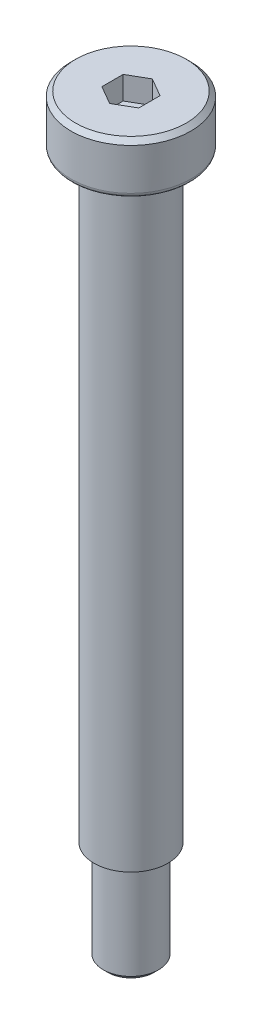
ISO-10303-21;
HEADER;
FILE_DESCRIPTION(('STEP AP214'),'2;1');
FILE_NAME('part.step','',(''),(''),'','','');
FILE_SCHEMA(('AUTOMOTIVE_DESIGN { 1 0 10303 214 1 1 1 1 }'));
ENDSEC;
DATA;
#1=APPLICATION_CONTEXT('core data for automotive mechanical design processes');
#2=APPLICATION_PROTOCOL_DEFINITION('international standard','automotive_design',2000,#1);
#3=PRODUCT_CONTEXT('',#1,'mechanical');
#4=PRODUCT('Part','Part','',(#3));
#5=PRODUCT_RELATED_PRODUCT_CATEGORY('part','',(#4));
#6=PRODUCT_DEFINITION_FORMATION('','',#4);
#7=PRODUCT_DEFINITION_CONTEXT('part definition',#1,'design');
#8=PRODUCT_DEFINITION('design','',#6,#7);
#9=PRODUCT_DEFINITION_SHAPE('','',#8);
#10=(LENGTH_UNIT() NAMED_UNIT(*) SI_UNIT(.MILLI.,.METRE.));
#11=(NAMED_UNIT(*) PLANE_ANGLE_UNIT() SI_UNIT($,.RADIAN.));
#12=(NAMED_UNIT(*) SI_UNIT($,.STERADIAN.) SOLID_ANGLE_UNIT());
#13=UNCERTAINTY_MEASURE_WITH_UNIT(LENGTH_MEASURE(1.E-05),#10,'distance_accuracy_value','');
#14=(GEOMETRIC_REPRESENTATION_CONTEXT(3) GLOBAL_UNCERTAINTY_ASSIGNED_CONTEXT((#13)) GLOBAL_UNIT_ASSIGNED_CONTEXT((#10,
#11,#12)) REPRESENTATION_CONTEXT('',''));
#15=CARTESIAN_POINT('',(0.,0.,0.));
#16=DIRECTION('',(0.,0.,1.));
#17=DIRECTION('',(1.,0.,0.));
#18=AXIS2_PLACEMENT_3D('',#15,#16,#17);
#19=CARTESIAN_POINT('',(0.,0.,0.));
#20=DIRECTION('',(0.,-1.,0.));
#21=DIRECTION('',(1.,0.,0.));
#22=AXIS2_PLACEMENT_3D('',#19,#20,#21);
#23=PLANE('',#22);
#24=CARTESIAN_POINT('',(0.,0.,0.));
#25=DIRECTION('',(0.,-1.,0.));
#26=DIRECTION('',(1.,0.,0.));
#27=AXIS2_PLACEMENT_3D('',#24,#25,#26);
#28=CIRCLE('',#27,6.);
#29=CARTESIAN_POINT('',(6.,0.,0.));
#30=VERTEX_POINT('',#29);
#31=EDGE_CURVE('E166',#30,#30,#28,.F.);
#32=ORIENTED_EDGE('',*,*,#31,.T.);
#33=EDGE_LOOP('',(#32));
#34=FACE_BOUND('',#33,.T.);
#35=DIRECTION('',(0.866025403784439,0.,-0.5));
#36=VECTOR('',#35,1.);
#37=CARTESIAN_POINT('',(0.,0.,2.3094010767585));
#38=LINE('',#37,#36);
#39=CARTESIAN_POINT('',(0.,0.,2.3094010767585));
#40=VERTEX_POINT('',#39);
#41=CARTESIAN_POINT('',(2.,0.,1.15470053837925));
#42=VERTEX_POINT('',#41);
#43=EDGE_CURVE('E133',#40,#42,#38,.T.);
#44=ORIENTED_EDGE('',*,*,#43,.F.);
#45=DIRECTION('',(0.866025403784439,0.,0.5));
#46=VECTOR('',#45,1.);
#47=CARTESIAN_POINT('',(-2.,0.,1.15470053837925));
#48=LINE('',#47,#46);
#49=CARTESIAN_POINT('',(-2.,0.,1.15470053837925));
#50=VERTEX_POINT('',#49);
#51=EDGE_CURVE('E59',#50,#40,#48,.T.);
#52=ORIENTED_EDGE('',*,*,#51,.F.);
#53=DIRECTION('',(0.,0.,1.));
#54=VECTOR('',#53,1.);
#55=CARTESIAN_POINT('',(-2.,0.,-1.15470053837925));
#56=LINE('',#55,#54);
#57=CARTESIAN_POINT('',(-2.,0.,-1.15470053837925));
#58=VERTEX_POINT('',#57);
#59=EDGE_CURVE('E142',#58,#50,#56,.T.);
#60=ORIENTED_EDGE('',*,*,#59,.F.);
#61=DIRECTION('',(-0.866025403784439,0.,0.5));
#62=VECTOR('',#61,1.);
#63=CARTESIAN_POINT('',(0.,0.,-2.3094010767585));
#64=LINE('',#63,#62);
#65=CARTESIAN_POINT('',(0.,0.,-2.3094010767585));
#66=VERTEX_POINT('',#65);
#67=EDGE_CURVE('E140',#66,#58,#64,.T.);
#68=ORIENTED_EDGE('',*,*,#67,.F.);
#69=DIRECTION('',(-0.866025403784438,0.,-0.5));
#70=VECTOR('',#69,1.);
#71=CARTESIAN_POINT('',(2.,0.,-1.15470053837925));
#72=LINE('',#71,#70);
#73=CARTESIAN_POINT('',(2.,0.,-1.15470053837925));
#74=VERTEX_POINT('',#73);
#75=EDGE_CURVE('E107',#74,#66,#72,.T.);
#76=ORIENTED_EDGE('',*,*,#75,.F.);
#77=DIRECTION('',(0.,0.,-1.));
#78=VECTOR('',#77,1.);
#79=CARTESIAN_POINT('',(2.,0.,1.15470053837925));
#80=LINE('',#79,#78);
#81=EDGE_CURVE('E136',#42,#74,#80,.T.);
#82=ORIENTED_EDGE('',*,*,#81,.F.);
#83=EDGE_LOOP('',(#44,#52,#60,#68,#76,#82));
#84=FACE_BOUND('',#83,.T.);
#85=ADVANCED_FACE('F43',(#34,#84),#23,.F.);
#86=CARTESIAN_POINT('',(0.,5.,0.));
#87=DIRECTION('',(0.,1.,0.));
#88=DIRECTION('',(-1.,0.,0.));
#89=AXIS2_PLACEMENT_3D('',#86,#87,#88);
#90=CYLINDRICAL_SURFACE('',#89,6.5);
#91=CARTESIAN_POINT('',(0.,-5.00000000000001,0.));
#92=DIRECTION('',(0.,1.,0.));
#93=DIRECTION('',(-1.,0.,0.));
#94=AXIS2_PLACEMENT_3D('',#91,#92,#93);
#95=CIRCLE('',#94,6.5);
#96=CARTESIAN_POINT('',(-6.5,-5.00000000000001,0.));
#97=VERTEX_POINT('',#96);
#98=EDGE_CURVE('E172',#97,#97,#95,.T.);
#99=ORIENTED_EDGE('',*,*,#98,.T.);
#100=EDGE_LOOP('',(#99));
#101=FACE_BOUND('',#100,.T.);
#102=CARTESIAN_POINT('',(0.,-0.500000000000005,0.));
#103=DIRECTION('',(0.,-1.,0.));
#104=DIRECTION('',(1.,0.,0.));
#105=AXIS2_PLACEMENT_3D('',#102,#103,#104);
#106=CIRCLE('',#105,6.5);
#107=CARTESIAN_POINT('',(6.5,-0.500000000000004,0.));
#108=VERTEX_POINT('',#107);
#109=EDGE_CURVE('E169',#108,#108,#106,.T.);
#110=ORIENTED_EDGE('',*,*,#109,.T.);
#111=EDGE_LOOP('',(#110));
#112=FACE_BOUND('',#111,.T.);
#113=ADVANCED_FACE('F194',(#101,#112),#90,.T.);
#114=CARTESIAN_POINT('',(6.5,-5.50000000000001,0.));
#115=DIRECTION('',(0.,1.,0.));
#116=DIRECTION('',(-1.,0.,0.));
#117=AXIS2_PLACEMENT_3D('',#114,#115,#116);
#118=PLANE('',#117);
#119=CARTESIAN_POINT('',(0.,-5.50000000000001,0.));
#120=DIRECTION('',(0.,1.,0.));
#121=DIRECTION('',(-1.,0.,0.));
#122=AXIS2_PLACEMENT_3D('',#119,#120,#121);
#123=CIRCLE('',#122,6.);
#124=CARTESIAN_POINT('',(-6.,-5.50000000000001,0.));
#125=VERTEX_POINT('',#124);
#126=EDGE_CURVE('E175',#125,#125,#123,.F.);
#127=ORIENTED_EDGE('',*,*,#126,.T.);
#128=EDGE_LOOP('',(#127));
#129=FACE_BOUND('',#128,.T.);
#130=CARTESIAN_POINT('',(0.,-5.50000000000001,0.));
#131=DIRECTION('',(0.,1.,0.));
#132=DIRECTION('',(-1.,0.,0.));
#133=AXIS2_PLACEMENT_3D('',#130,#131,#132);
#134=CIRCLE('',#133,3.75);
#135=CARTESIAN_POINT('',(-3.75,-5.50000000000001,0.));
#136=VERTEX_POINT('',#135);
#137=EDGE_CURVE('E163',#136,#136,#134,.T.);
#138=ORIENTED_EDGE('',*,*,#137,.T.);
#139=EDGE_LOOP('',(#138));
#140=FACE_BOUND('',#139,.T.);
#141=ADVANCED_FACE('F202',(#129,#140),#118,.F.);
#142=CARTESIAN_POINT('',(0.,5.,0.));
#143=DIRECTION('',(0.,1.,0.));
#144=DIRECTION('',(-1.,0.,0.));
#145=AXIS2_PLACEMENT_3D('',#142,#143,#144);
#146=CYLINDRICAL_SURFACE('',#145,3.75);
#147=ORIENTED_EDGE('',*,*,#137,.F.);
#148=EDGE_LOOP('',(#147));
#149=FACE_BOUND('',#148,.T.);
#150=CARTESIAN_POINT('',(0.,-5.75000000000001,0.));
#151=DIRECTION('',(0.,1.,0.));
#152=DIRECTION('',(-1.,0.,0.));
#153=AXIS2_PLACEMENT_3D('',#150,#151,#152);
#154=CIRCLE('',#153,3.75);
#155=CARTESIAN_POINT('',(-3.75,-5.75000000000001,0.));
#156=VERTEX_POINT('',#155);
#157=EDGE_CURVE('E160',#156,#156,#154,.T.);
#158=ORIENTED_EDGE('',*,*,#157,.T.);
#159=EDGE_LOOP('',(#158));
#160=FACE_BOUND('',#159,.T.);
#161=ADVANCED_FACE('F256',(#149,#160),#146,.T.);
#162=CARTESIAN_POINT('',(3.75,-5.75000000000001,0.));
#163=DIRECTION('',(0.,-1.,0.));
#164=DIRECTION('',(1.,0.,0.));
#165=AXIS2_PLACEMENT_3D('',#162,#163,#164);
#166=PLANE('',#165);
#167=ORIENTED_EDGE('',*,*,#157,.F.);
#168=EDGE_LOOP('',(#167));
#169=FACE_BOUND('',#168,.T.);
#170=CARTESIAN_POINT('',(0.,-5.75000000000001,0.));
#171=DIRECTION('',(0.,1.,0.));
#172=DIRECTION('',(-1.,0.,0.));
#173=AXIS2_PLACEMENT_3D('',#170,#171,#172);
#174=CIRCLE('',#173,4.);
#175=CARTESIAN_POINT('',(-4.,-5.75000000000001,0.));
#176=VERTEX_POINT('',#175);
#177=EDGE_CURVE('E157',#176,#176,#174,.T.);
#178=ORIENTED_EDGE('',*,*,#177,.T.);
#179=EDGE_LOOP('',(#178));
#180=FACE_BOUND('',#179,.T.);
#181=ADVANCED_FACE('F252',(#169,#180),#166,.F.);
#182=CARTESIAN_POINT('',(0.,5.,0.));
#183=DIRECTION('',(0.,1.,0.));
#184=DIRECTION('',(-1.,0.,0.));
#185=AXIS2_PLACEMENT_3D('',#182,#183,#184);
#186=CYLINDRICAL_SURFACE('',#185,4.00000000000001);
#187=ORIENTED_EDGE('',*,*,#177,.F.);
#188=EDGE_LOOP('',(#187));
#189=FACE_BOUND('',#188,.T.);
#190=CARTESIAN_POINT('',(0.,-70.5,0.));
#191=DIRECTION('',(0.,1.,0.));
#192=DIRECTION('',(-1.,0.,0.));
#193=AXIS2_PLACEMENT_3D('',#190,#191,#192);
#194=CIRCLE('',#193,4.00000000000001);
#195=CARTESIAN_POINT('',(-4.,-70.5,0.));
#196=VERTEX_POINT('',#195);
#197=EDGE_CURVE('E154',#196,#196,#194,.T.);
#198=ORIENTED_EDGE('',*,*,#197,.T.);
#199=EDGE_LOOP('',(#198));
#200=FACE_BOUND('',#199,.T.);
#201=ADVANCED_FACE('F248',(#189,#200),#186,.T.);
#202=CARTESIAN_POINT('',(4.00000000000002,-70.5,0.));
#203=DIRECTION('',(0.,1.,0.));
#204=DIRECTION('',(-1.,0.,0.));
#205=AXIS2_PLACEMENT_3D('',#202,#203,#204);
#206=PLANE('',#205);
#207=ORIENTED_EDGE('',*,*,#197,.F.);
#208=EDGE_LOOP('',(#207));
#209=FACE_BOUND('',#208,.T.);
#210=CARTESIAN_POINT('',(0.,-70.5,0.));
#211=DIRECTION('',(0.,1.,0.));
#212=DIRECTION('',(-1.,0.,0.));
#213=AXIS2_PLACEMENT_3D('',#210,#211,#212);
#214=CIRCLE('',#213,3.);
#215=CARTESIAN_POINT('',(-2.99999999999999,-70.5,0.));
#216=VERTEX_POINT('',#215);
#217=EDGE_CURVE('E146',#216,#216,#214,.T.);
#218=ORIENTED_EDGE('',*,*,#217,.T.);
#219=EDGE_LOOP('',(#218));
#220=FACE_BOUND('',#219,.T.);
#221=ADVANCED_FACE('F245',(#209,#220),#206,.F.);
#222=CARTESIAN_POINT('',(0.,5.,0.));
#223=DIRECTION('',(0.,1.,0.));
#224=DIRECTION('',(-1.,0.,0.));
#225=AXIS2_PLACEMENT_3D('',#222,#223,#224);
#226=CYLINDRICAL_SURFACE('',#225,3.);
#227=CARTESIAN_POINT('',(0.,-81.,0.));
#228=DIRECTION('',(0.,1.,0.));
#229=DIRECTION('',(-1.,0.,0.));
#230=AXIS2_PLACEMENT_3D('',#227,#228,#229);
#231=CIRCLE('',#230,3.);
#232=CARTESIAN_POINT('',(-2.99999999999999,-81.,0.));
#233=VERTEX_POINT('',#232);
#234=EDGE_CURVE('E52',#233,#233,#231,.T.);
#235=ORIENTED_EDGE('',*,*,#234,.T.);
#236=EDGE_LOOP('',(#235));
#237=FACE_BOUND('',#236,.T.);
#238=ORIENTED_EDGE('',*,*,#217,.F.);
#239=EDGE_LOOP('',(#238));
#240=FACE_BOUND('',#239,.T.);
#241=ADVANCED_FACE('F180',(#237,#240),#226,.T.);
#242=CARTESIAN_POINT('',(3.00000000000001,-81.5,0.));
#243=DIRECTION('',(0.,1.,0.));
#244=DIRECTION('',(-1.,0.,0.));
#245=AXIS2_PLACEMENT_3D('',#242,#243,#244);
#246=PLANE('',#245);
#247=CARTESIAN_POINT('',(0.,-81.5,0.));
#248=DIRECTION('',(0.,1.,0.));
#249=DIRECTION('',(-1.,0.,0.));
#250=AXIS2_PLACEMENT_3D('',#247,#248,#249);
#251=CIRCLE('',#250,2.49999999999997);
#252=CARTESIAN_POINT('',(-2.49999999999996,-81.5,0.));
#253=VERTEX_POINT('',#252);
#254=EDGE_CURVE('E11',#253,#253,#251,.F.);
#255=ORIENTED_EDGE('',*,*,#254,.T.);
#256=EDGE_LOOP('',(#255));
#257=FACE_BOUND('',#256,.T.);
#258=ADVANCED_FACE('F240',(#257),#246,.F.);
#259=CARTESIAN_POINT('',(-2.,-2.5,1.15470053837925));
#260=DIRECTION('',(-0.5,0.,0.866025403784439));
#261=DIRECTION('',(0.866025403784439,0.,0.5));
#262=AXIS2_PLACEMENT_3D('',#259,#260,#261);
#263=PLANE('',#262);
#264=ORIENTED_EDGE('',*,*,#51,.T.);
#265=DIRECTION('',(0.,1.,0.));
#266=VECTOR('',#265,1.);
#267=CARTESIAN_POINT('',(0.,-2.5,2.3094010767585));
#268=LINE('',#267,#266);
#269=CARTESIAN_POINT('',(0.,-2.5,2.3094010767585));
#270=VERTEX_POINT('',#269);
#271=EDGE_CURVE('E89',#270,#40,#268,.T.);
#272=ORIENTED_EDGE('',*,*,#271,.F.);
#273=DIRECTION('',(0.866025403784439,0.,0.5));
#274=VECTOR('',#273,1.);
#275=CARTESIAN_POINT('',(-2.,-2.5,1.15470053837925));
#276=LINE('',#275,#274);
#277=CARTESIAN_POINT('',(-2.,-2.5,1.15470053837925));
#278=VERTEX_POINT('',#277);
#279=EDGE_CURVE('E144',#278,#270,#276,.T.);
#280=ORIENTED_EDGE('',*,*,#279,.F.);
#281=DIRECTION('',(0.,1.,0.));
#282=VECTOR('',#281,1.);
#283=CARTESIAN_POINT('',(-2.,-2.5,1.15470053837925));
#284=LINE('',#283,#282);
#285=EDGE_CURVE('E67',#278,#50,#284,.T.);
#286=ORIENTED_EDGE('',*,*,#285,.T.);
#287=EDGE_LOOP('',(#264,#272,#280,#286));
#288=FACE_BOUND('',#287,.T.);
#289=ADVANCED_FACE('F230',(#288),#263,.F.);
#290=CARTESIAN_POINT('',(-2.,-2.5,-1.15470053837925));
#291=DIRECTION('',(-1.,0.,0.));
#292=DIRECTION('',(0.,-1.,0.));
#293=AXIS2_PLACEMENT_3D('',#290,#291,#292);
#294=PLANE('',#293);
#295=ORIENTED_EDGE('',*,*,#59,.T.);
#296=ORIENTED_EDGE('',*,*,#285,.F.);
#297=DIRECTION('',(0.,0.,1.));
#298=VECTOR('',#297,1.);
#299=CARTESIAN_POINT('',(-2.,-2.5,-1.15470053837925));
#300=LINE('',#299,#298);
#301=CARTESIAN_POINT('',(-2.,-2.5,-1.15470053837925));
#302=VERTEX_POINT('',#301);
#303=EDGE_CURVE('E119',#302,#278,#300,.T.);
#304=ORIENTED_EDGE('',*,*,#303,.F.);
#305=DIRECTION('',(0.,1.,0.));
#306=VECTOR('',#305,1.);
#307=CARTESIAN_POINT('',(-2.,-2.5,-1.15470053837925));
#308=LINE('',#307,#306);
#309=EDGE_CURVE('E111',#302,#58,#308,.T.);
#310=ORIENTED_EDGE('',*,*,#309,.T.);
#311=EDGE_LOOP('',(#295,#296,#304,#310));
#312=FACE_BOUND('',#311,.T.);
#313=ADVANCED_FACE('F227',(#312),#294,.F.);
#314=CARTESIAN_POINT('',(0.,-2.5,-2.3094010767585));
#315=DIRECTION('',(-0.5,0.,-0.866025403784439));
#316=DIRECTION('',(-0.866025403784439,0.,0.5));
#317=AXIS2_PLACEMENT_3D('',#314,#315,#316);
#318=PLANE('',#317);
#319=ORIENTED_EDGE('',*,*,#67,.T.);
#320=ORIENTED_EDGE('',*,*,#309,.F.);
#321=DIRECTION('',(-0.866025403784439,0.,0.5));
#322=VECTOR('',#321,1.);
#323=CARTESIAN_POINT('',(0.,-2.5,-2.3094010767585));
#324=LINE('',#323,#322);
#325=CARTESIAN_POINT('',(0.,-2.5,-2.3094010767585));
#326=VERTEX_POINT('',#325);
#327=EDGE_CURVE('E115',#326,#302,#324,.T.);
#328=ORIENTED_EDGE('',*,*,#327,.F.);
#329=DIRECTION('',(0.,1.,0.));
#330=VECTOR('',#329,1.);
#331=CARTESIAN_POINT('',(0.,-2.5,-2.3094010767585));
#332=LINE('',#331,#330);
#333=EDGE_CURVE('E100',#326,#66,#332,.T.);
#334=ORIENTED_EDGE('',*,*,#333,.T.);
#335=EDGE_LOOP('',(#319,#320,#328,#334));
#336=FACE_BOUND('',#335,.T.);
#337=ADVANCED_FACE('F116',(#336),#318,.F.);
#338=CARTESIAN_POINT('',(2.,-2.5,-1.15470053837925));
#339=DIRECTION('',(0.5,0.,-0.866025403784439));
#340=DIRECTION('',(-0.866025403784439,0.,-0.5));
#341=AXIS2_PLACEMENT_3D('',#338,#339,#340);
#342=PLANE('',#341);
#343=ORIENTED_EDGE('',*,*,#75,.T.);
#344=ORIENTED_EDGE('',*,*,#333,.F.);
#345=DIRECTION('',(-0.866025403784438,0.,-0.5));
#346=VECTOR('',#345,1.);
#347=CARTESIAN_POINT('',(2.,-2.5,-1.15470053837925));
#348=LINE('',#347,#346);
#349=CARTESIAN_POINT('',(2.,-2.5,-1.15470053837925));
#350=VERTEX_POINT('',#349);
#351=EDGE_CURVE('E104',#350,#326,#348,.T.);
#352=ORIENTED_EDGE('',*,*,#351,.F.);
#353=DIRECTION('',(0.,1.,0.));
#354=VECTOR('',#353,1.);
#355=CARTESIAN_POINT('',(2.,-2.5,-1.15470053837925));
#356=LINE('',#355,#354);
#357=EDGE_CURVE('E112',#350,#74,#356,.T.);
#358=ORIENTED_EDGE('',*,*,#357,.T.);
#359=EDGE_LOOP('',(#343,#344,#352,#358));
#360=FACE_BOUND('',#359,.T.);
#361=ADVANCED_FACE('F102',(#360),#342,.F.);
#362=CARTESIAN_POINT('',(2.,-2.5,1.15470053837925));
#363=DIRECTION('',(1.,0.,0.));
#364=DIRECTION('',(0.,1.,0.));
#365=AXIS2_PLACEMENT_3D('',#362,#363,#364);
#366=PLANE('',#365);
#367=ORIENTED_EDGE('',*,*,#81,.T.);
#368=ORIENTED_EDGE('',*,*,#357,.F.);
#369=DIRECTION('',(0.,0.,-1.));
#370=VECTOR('',#369,1.);
#371=CARTESIAN_POINT('',(2.,-2.5,1.15470053837925));
#372=LINE('',#371,#370);
#373=CARTESIAN_POINT('',(2.,-2.5,1.15470053837925));
#374=VERTEX_POINT('',#373);
#375=EDGE_CURVE('E125',#374,#350,#372,.T.);
#376=ORIENTED_EDGE('',*,*,#375,.F.);
#377=DIRECTION('',(0.,1.,0.));
#378=VECTOR('',#377,1.);
#379=CARTESIAN_POINT('',(2.,-2.5,1.15470053837925));
#380=LINE('',#379,#378);
#381=EDGE_CURVE('E149',#374,#42,#380,.T.);
#382=ORIENTED_EDGE('',*,*,#381,.T.);
#383=EDGE_LOOP('',(#367,#368,#376,#382));
#384=FACE_BOUND('',#383,.T.);
#385=ADVANCED_FACE('F223',(#384),#366,.F.);
#386=CARTESIAN_POINT('',(0.,-2.5,2.3094010767585));
#387=DIRECTION('',(0.5,0.,0.866025403784439));
#388=DIRECTION('',(0.866025403784439,0.,-0.5));
#389=AXIS2_PLACEMENT_3D('',#386,#387,#388);
#390=PLANE('',#389);
#391=ORIENTED_EDGE('',*,*,#43,.T.);
#392=ORIENTED_EDGE('',*,*,#381,.F.);
#393=DIRECTION('',(0.866025403784439,0.,-0.5));
#394=VECTOR('',#393,1.);
#395=CARTESIAN_POINT('',(0.,-2.5,2.3094010767585));
#396=LINE('',#395,#394);
#397=EDGE_CURVE('E127',#270,#374,#396,.T.);
#398=ORIENTED_EDGE('',*,*,#397,.F.);
#399=ORIENTED_EDGE('',*,*,#271,.T.);
#400=EDGE_LOOP('',(#391,#392,#398,#399));
#401=FACE_BOUND('',#400,.T.);
#402=ADVANCED_FACE('F214',(#401),#390,.F.);
#403=CARTESIAN_POINT('',(0.,-2.5,0.));
#404=DIRECTION('',(0.,1.,0.));
#405=DIRECTION('',(-1.,0.,0.));
#406=AXIS2_PLACEMENT_3D('',#403,#404,#405);
#407=PLANE('',#406);
#408=ORIENTED_EDGE('',*,*,#279,.T.);
#409=ORIENTED_EDGE('',*,*,#397,.T.);
#410=ORIENTED_EDGE('',*,*,#375,.T.);
#411=ORIENTED_EDGE('',*,*,#351,.T.);
#412=ORIENTED_EDGE('',*,*,#327,.T.);
#413=ORIENTED_EDGE('',*,*,#303,.T.);
#414=EDGE_LOOP('',(#408,#409,#410,#411,#412,#413));
#415=FACE_BOUND('',#414,.T.);
#416=ADVANCED_FACE('F122',(#415),#407,.T.);
#417=CARTESIAN_POINT('',(0.,0.,0.));
#418=DIRECTION('',(0.,-1.,0.));
#419=DIRECTION('',(1.,0.,0.));
#420=AXIS2_PLACEMENT_3D('',#417,#418,#419);
#421=CONICAL_SURFACE('',#420,6.,0.785398163397446);
#422=ORIENTED_EDGE('',*,*,#109,.F.);
#423=EDGE_LOOP('',(#422));
#424=FACE_BOUND('',#423,.T.);
#425=ORIENTED_EDGE('',*,*,#31,.F.);
#426=EDGE_LOOP('',(#425));
#427=FACE_BOUND('',#426,.T.);
#428=ADVANCED_FACE('F190',(#424,#427),#421,.T.);
#429=CARTESIAN_POINT('',(0.,-5.00000000000001,0.));
#430=DIRECTION('',(0.,1.,0.));
#431=DIRECTION('',(-1.,0.,0.));
#432=AXIS2_PLACEMENT_3D('',#429,#430,#431);
#433=TOROIDAL_SURFACE('',#432,6.,0.5);
#434=ORIENTED_EDGE('',*,*,#126,.F.);
#435=EDGE_LOOP('',(#434));
#436=FACE_BOUND('',#435,.T.);
#437=ORIENTED_EDGE('',*,*,#98,.F.);
#438=EDGE_LOOP('',(#437));
#439=FACE_BOUND('',#438,.T.);
#440=ADVANCED_FACE('F184',(#436,#439),#433,.T.);
#441=CARTESIAN_POINT('',(0.,-81.,0.));
#442=DIRECTION('',(0.,1.,0.));
#443=DIRECTION('',(-1.,0.,0.));
#444=AXIS2_PLACEMENT_3D('',#441,#442,#443);
#445=CONICAL_SURFACE('',#444,3.,0.785398163397447);
#446=ORIENTED_EDGE('',*,*,#254,.F.);
#447=EDGE_LOOP('',(#446));
#448=FACE_BOUND('',#447,.T.);
#449=ORIENTED_EDGE('',*,*,#234,.F.);
#450=EDGE_LOOP('',(#449));
#451=FACE_BOUND('',#450,.T.);
#452=ADVANCED_FACE('F46',(#448,#451),#445,.T.);
#453=CLOSED_SHELL('',(#85,#113,#141,#161,#181,#201,#221,#241,#258,#289,#313,#337,#361,#385,#402,
#416,#428,#440,#452));
#454=MANIFOLD_SOLID_BREP('B2',#453);
#455=ADVANCED_BREP_SHAPE_REPRESENTATION('',(#18,#454),#14);
#456=SHAPE_DEFINITION_REPRESENTATION(#9,#455);
ENDSEC;
END-ISO-10303-21;
